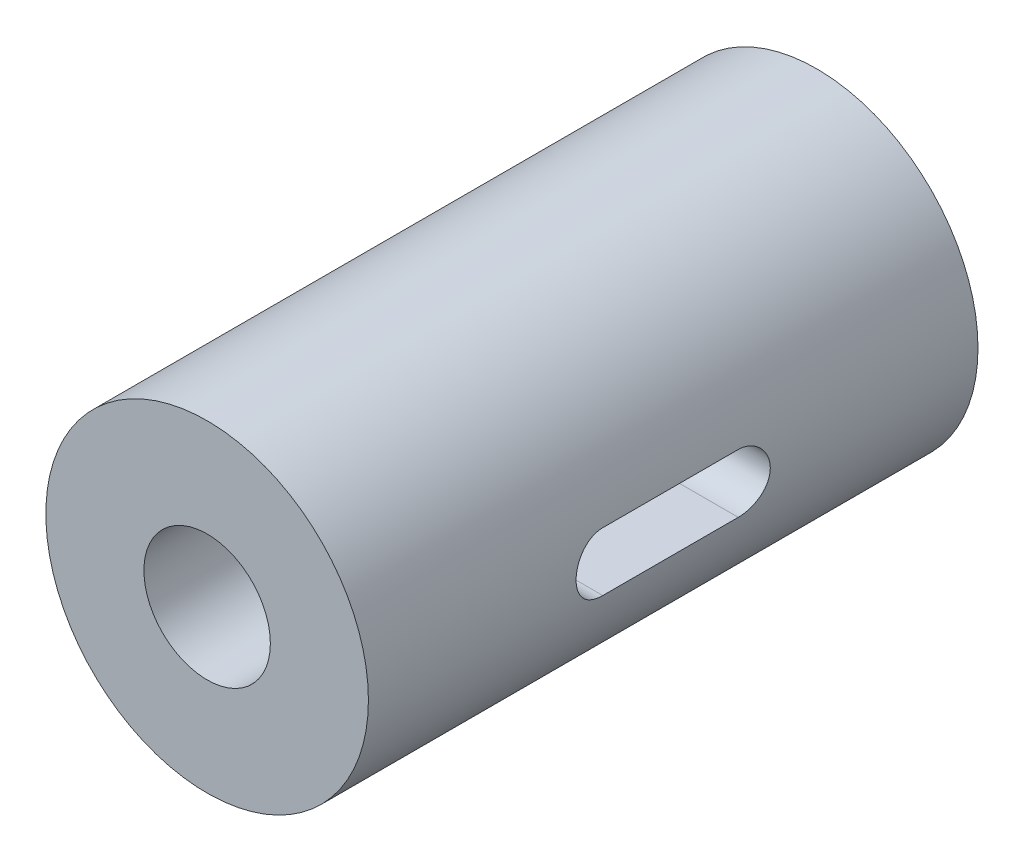
ISO-10303-21;
HEADER;
FILE_DESCRIPTION(('STEP AP214'),'2;1');
FILE_NAME('part.step','',(''),(''),'','','');
FILE_SCHEMA(('AUTOMOTIVE_DESIGN { 1 0 10303 214 1 1 1 1 }'));
ENDSEC;
DATA;
#1=APPLICATION_CONTEXT('core data for automotive mechanical design processes');
#2=APPLICATION_PROTOCOL_DEFINITION('international standard','automotive_design',2000,#1);
#3=PRODUCT_CONTEXT('',#1,'mechanical');
#4=PRODUCT('Part','Part','',(#3));
#5=PRODUCT_RELATED_PRODUCT_CATEGORY('part','',(#4));
#6=PRODUCT_DEFINITION_FORMATION('','',#4);
#7=PRODUCT_DEFINITION_CONTEXT('part definition',#1,'design');
#8=PRODUCT_DEFINITION('design','',#6,#7);
#9=PRODUCT_DEFINITION_SHAPE('','',#8);
#10=(LENGTH_UNIT() NAMED_UNIT(*) SI_UNIT(.MILLI.,.METRE.));
#11=(NAMED_UNIT(*) PLANE_ANGLE_UNIT() SI_UNIT($,.RADIAN.));
#12=(NAMED_UNIT(*) SI_UNIT($,.STERADIAN.) SOLID_ANGLE_UNIT());
#13=UNCERTAINTY_MEASURE_WITH_UNIT(LENGTH_MEASURE(1.E-05),#10,'distance_accuracy_value','');
#14=(GEOMETRIC_REPRESENTATION_CONTEXT(3) GLOBAL_UNCERTAINTY_ASSIGNED_CONTEXT((#13)) GLOBAL_UNIT_ASSIGNED_CONTEXT((#10,
#11,#12)) REPRESENTATION_CONTEXT('',''));
#15=CARTESIAN_POINT('',(0.,0.,0.));
#16=DIRECTION('',(0.,0.,1.));
#17=DIRECTION('',(1.,0.,0.));
#18=AXIS2_PLACEMENT_3D('',#15,#16,#17);
#19=CARTESIAN_POINT('',(-24.24,-23.1439997287949,0.));
#20=DIRECTION('',(0.,0.,1.));
#21=DIRECTION('',(1.,0.,0.));
#22=AXIS2_PLACEMENT_3D('',#19,#20,#21);
#23=PLANE('',#22);
#24=CARTESIAN_POINT('',(-24.24,-23.1439997287949,0.));
#25=DIRECTION('',(0.,0.,1.));
#26=DIRECTION('',(1.,0.,0.));
#27=AXIS2_PLACEMENT_3D('',#24,#25,#26);
#28=CIRCLE('',#27,1.8669);
#29=CARTESIAN_POINT('',(-22.3731,-23.1439997287949,0.));
#30=VERTEX_POINT('',#29);
#31=EDGE_CURVE('E200',#30,#30,#28,.T.);
#32=ORIENTED_EDGE('',*,*,#31,.T.);
#33=EDGE_LOOP('',(#32));
#34=FACE_BOUND('',#33,.T.);
#35=CARTESIAN_POINT('',(-24.24,-23.1439997287949,0.));
#36=DIRECTION('',(0.,0.,1.));
#37=DIRECTION('',(1.,0.,0.));
#38=AXIS2_PLACEMENT_3D('',#35,#36,#37);
#39=CIRCLE('',#38,4.7625);
#40=CARTESIAN_POINT('',(-19.4775,-23.1439997287949,0.));
#41=VERTEX_POINT('',#40);
#42=EDGE_CURVE('E204',#41,#41,#39,.T.);
#43=ORIENTED_EDGE('',*,*,#42,.F.);
#44=EDGE_LOOP('',(#43));
#45=FACE_BOUND('',#44,.T.);
#46=ADVANCED_FACE('F20',(#34,#45),#23,.F.);
#47=CARTESIAN_POINT('',(-24.24,-23.1439997287949,18.));
#48=DIRECTION('',(0.,0.,1.));
#49=DIRECTION('',(1.,0.,0.));
#50=AXIS2_PLACEMENT_3D('',#47,#48,#49);
#51=PLANE('',#50);
#52=CARTESIAN_POINT('',(-24.24,-23.1439997287949,18.));
#53=DIRECTION('',(0.,0.,1.));
#54=DIRECTION('',(1.,0.,0.));
#55=AXIS2_PLACEMENT_3D('',#52,#53,#54);
#56=CIRCLE('',#55,1.8669);
#57=CARTESIAN_POINT('',(-22.3731,-23.1439997287949,18.));
#58=VERTEX_POINT('',#57);
#59=EDGE_CURVE('E197',#58,#58,#56,.T.);
#60=ORIENTED_EDGE('',*,*,#59,.F.);
#61=EDGE_LOOP('',(#60));
#62=FACE_BOUND('',#61,.T.);
#63=CARTESIAN_POINT('',(-24.24,-23.1439997287949,18.));
#64=DIRECTION('',(0.,0.,1.));
#65=DIRECTION('',(1.,0.,0.));
#66=AXIS2_PLACEMENT_3D('',#63,#64,#65);
#67=CIRCLE('',#66,4.7625);
#68=CARTESIAN_POINT('',(-19.4775,-23.1439997287949,18.));
#69=VERTEX_POINT('',#68);
#70=EDGE_CURVE('E203',#69,#69,#67,.T.);
#71=ORIENTED_EDGE('',*,*,#70,.T.);
#72=EDGE_LOOP('',(#71));
#73=FACE_BOUND('',#72,.T.);
#74=ADVANCED_FACE('F22',(#62,#73),#51,.T.);
#75=CARTESIAN_POINT('',(-24.24,-23.1439997287949,0.));
#76=DIRECTION('',(0.,0.,1.));
#77=DIRECTION('',(1.,0.,0.));
#78=AXIS2_PLACEMENT_3D('',#75,#76,#77);
#79=CYLINDRICAL_SURFACE('',#78,4.7625);
#80=CARTESIAN_POINT('',(-19.5570638868334,-22.277099728795,11.));
#81=CARTESIAN_POINT('',(-19.5570932262736,-22.2770564212069,11.048341648724));
#82=CARTESIAN_POINT('',(-19.5563161306143,-22.2811404912829,11.0966616937286));
#83=CARTESIAN_POINT('',(-19.5533688885122,-22.2972326885362,11.1918525928624));
#84=CARTESIAN_POINT('',(-19.5512007258954,-22.3092295318456,11.2387254112901));
#85=CARTESIAN_POINT('',(-19.5456895382325,-22.3408210013647,11.3297688834935));
#86=CARTESIAN_POINT('',(-19.5423463112153,-22.3604169337729,11.3739390712052));
#87=CARTESIAN_POINT('',(-19.5348721451521,-22.4066209059899,11.4583698840435));
#88=CARTESIAN_POINT('',(-19.5307411644869,-22.4332293163156,11.4986303024366));
#89=CARTESIAN_POINT('',(-19.522101162779,-22.4930347652497,11.5745609487893));
#90=CARTESIAN_POINT('',(-19.5175886578223,-22.5262974290518,11.6101791009056));
#91=CARTESIAN_POINT('',(-19.5087249651163,-22.598328106054,11.6753649693394));
#92=CARTESIAN_POINT('',(-19.5043738022826,-22.6370969651312,11.7049317543221));
#93=CARTESIAN_POINT('',(-19.4962858532765,-22.7193813271402,11.7573715228513));
#94=CARTESIAN_POINT('',(-19.4925536807075,-22.7629287765019,11.780195151356));
#95=CARTESIAN_POINT('',(-19.4861636920902,-22.8533166788768,11.8181818381739));
#96=CARTESIAN_POINT('',(-19.4835057329271,-22.9001566922536,11.8333459170165));
#97=CARTESIAN_POINT('',(-19.4795881273201,-22.9952579678204,11.8554228374156));
#98=CARTESIAN_POINT('',(-19.4783134854278,-23.0434980463169,11.8624242272925));
#99=CARTESIAN_POINT('',(-19.4772544794617,-23.1404850246991,11.86825281692));
#100=CARTESIAN_POINT('',(-19.4774700304981,-23.1892318955571,11.8670804822926));
#101=CARTESIAN_POINT('',(-19.4793554191911,-23.2852394866604,11.8566628227031));
#102=CARTESIAN_POINT('',(-19.4810080449475,-23.3325109608594,11.8475130405213));
#103=CARTESIAN_POINT('',(-19.4855626043367,-23.4248359045784,11.8215512035274));
#104=CARTESIAN_POINT('',(-19.4884645730563,-23.4698893117667,11.8047389335209));
#105=CARTESIAN_POINT('',(-19.4952207253026,-23.5567793300984,11.7638369634896));
#106=CARTESIAN_POINT('',(-19.4990799439692,-23.5985973460272,11.7397086266397));
#107=CARTESIAN_POINT('',(-19.507323065086,-23.6776252921534,11.6848886446576));
#108=CARTESIAN_POINT('',(-19.5117069995712,-23.7148349407172,11.6541965987065));
#109=CARTESIAN_POINT('',(-19.5205878444077,-23.7841527908793,11.5865976286626));
#110=CARTESIAN_POINT('',(-19.5250854733405,-23.8161801864829,11.549607894926));
#111=CARTESIAN_POINT('',(-19.5336277733797,-23.8735970402874,11.4707261315686));
#112=CARTESIAN_POINT('',(-19.5376723170015,-23.8989846329167,11.4288327289499));
#113=CARTESIAN_POINT('',(-19.5448520162623,-23.9424227246049,11.3412233423957));
#114=CARTESIAN_POINT('',(-19.5479852531352,-23.9604577744001,11.2954995503767));
#115=CARTESIAN_POINT('',(-19.5529581808031,-23.9885422610652,11.2016317595259));
#116=CARTESIAN_POINT('',(-19.5547998011395,-23.9986036127504,11.1534914864592));
#117=CARTESIAN_POINT('',(-19.5562796385913,-24.0066539402234,11.0874805999237));
#118=CARTESIAN_POINT('',(-19.5565734431089,-24.0082467280365,11.0700083198718));
#119=CARTESIAN_POINT('',(-19.5569653843084,-24.0103682580658,11.0350266087597));
#120=CARTESIAN_POINT('',(-19.5570638496999,-24.0108987878253,11.0175172898293));
#121=CARTESIAN_POINT('',(-19.5570638868334,-24.0108997287949,11.));
#122=B_SPLINE_CURVE_WITH_KNOTS('',3,(#80,#81,#82,#83,#84,#85,#86,#87,#88,#89,#90,#91,#92,#93,
#94,#95,#96,#97,#98,#99,#100,#101,#102,#103,#104,#105,#106,#107,#108,#109,#110,#111,#112,#113,
#114,#115,#116,#117,#118,#119,#120,#121),.UNSPECIFIED.,.F.,.F.,(4,2,2,2,2,2,2,2,2,2,2,2,2,2,2,2,
2,2,2,2,4),(0.,0.144813919941381,0.289421775791772,0.434054499139951,0.578694865950792,
0.724839047417896,0.871005704296525,1.01821710018819,1.16540887701407,1.3109886161029,
1.45656006220548,1.60041164010353,1.74426725820042,1.88889622908486,2.03353403439601,
2.18024593684824,2.32699901646129,2.47405888577457,2.62089859219757,2.67351486670913,
2.72604252510231),.UNSPECIFIED.);
#123=CARTESIAN_POINT('',(-19.5570638868334,-22.277099728795,11.));
#124=VERTEX_POINT('',#123);
#125=CARTESIAN_POINT('',(-19.5570638868334,-24.0108997287949,11.));
#126=VERTEX_POINT('',#125);
#127=EDGE_CURVE('E100',#124,#126,#122,.T.);
#128=ORIENTED_EDGE('',*,*,#127,.F.);
#129=DIRECTION('',(0.,0.,1.));
#130=VECTOR('',#129,1.);
#131=CARTESIAN_POINT('',(-19.5570638868334,-22.277099728795,0.));
#132=LINE('',#131,#130);
#133=CARTESIAN_POINT('',(-19.5570638868334,-22.277099728795,7.));
#134=VERTEX_POINT('',#133);
#135=EDGE_CURVE('E86',#124,#134,#132,.F.);
#136=ORIENTED_EDGE('',*,*,#135,.T.);
#137=CARTESIAN_POINT('',(-19.5570638868334,-24.0108997287949,7.));
#138=CARTESIAN_POINT('',(-19.5570932262736,-24.010943036383,6.95165835127599));
#139=CARTESIAN_POINT('',(-19.5563161306143,-24.006858966307,6.90333830627141));
#140=CARTESIAN_POINT('',(-19.5533688885122,-23.9907667690537,6.80814740713765));
#141=CARTESIAN_POINT('',(-19.5512007258954,-23.9787699257443,6.76127458870992));
#142=CARTESIAN_POINT('',(-19.5456895382325,-23.9471784562252,6.6702311165065));
#143=CARTESIAN_POINT('',(-19.5423463112153,-23.927582523817,6.62606092879482));
#144=CARTESIAN_POINT('',(-19.5348721451521,-23.8813785516,6.54163011595649));
#145=CARTESIAN_POINT('',(-19.5307411644869,-23.8547701412743,6.5013696975634));
#146=CARTESIAN_POINT('',(-19.522101162779,-23.7949646923402,6.42543905121073));
#147=CARTESIAN_POINT('',(-19.5175886578223,-23.7617020285381,6.38982089909439));
#148=CARTESIAN_POINT('',(-19.5087249651163,-23.6896713515359,6.32463503066064));
#149=CARTESIAN_POINT('',(-19.5043738022826,-23.6509024924587,6.29506824567792));
#150=CARTESIAN_POINT('',(-19.4962858532765,-23.5686181304497,6.24262847714874));
#151=CARTESIAN_POINT('',(-19.4925536807075,-23.525070681088,6.21980484864398));
#152=CARTESIAN_POINT('',(-19.4861636920902,-23.4346827787131,6.18181816182608));
#153=CARTESIAN_POINT('',(-19.4835057329271,-23.3878427653363,6.16665408298355));
#154=CARTESIAN_POINT('',(-19.4795881273201,-23.2927414897695,6.14457716258443));
#155=CARTESIAN_POINT('',(-19.4783134854278,-23.244501411273,6.13757577270753));
#156=CARTESIAN_POINT('',(-19.4772544794617,-23.1475144328908,6.13174718308002));
#157=CARTESIAN_POINT('',(-19.4774700304981,-23.0987675620328,6.13291951770734));
#158=CARTESIAN_POINT('',(-19.4793554191911,-23.0027599709295,6.1433371772969));
#159=CARTESIAN_POINT('',(-19.4810080449475,-22.9554884967305,6.15248695947873));
#160=CARTESIAN_POINT('',(-19.4855626043367,-22.8631635530115,6.1784487964726));
#161=CARTESIAN_POINT('',(-19.4884645730563,-22.8181101458232,6.19526106647914));
#162=CARTESIAN_POINT('',(-19.4952207253026,-22.7312201274915,6.23616303651036));
#163=CARTESIAN_POINT('',(-19.4990799439692,-22.6894021115627,6.26029137336034));
#164=CARTESIAN_POINT('',(-19.507323065086,-22.6103741654365,6.31511135534238));
#165=CARTESIAN_POINT('',(-19.5117069995712,-22.5731645168727,6.34580340129347));
#166=CARTESIAN_POINT('',(-19.5205878444077,-22.5038466667106,6.41340237133737));
#167=CARTESIAN_POINT('',(-19.5250854733405,-22.471819271107,6.45039210507398));
#168=CARTESIAN_POINT('',(-19.5336277733797,-22.4144024173025,6.52927386843139));
#169=CARTESIAN_POINT('',(-19.5376723170015,-22.3890148246732,6.57116727105009));
#170=CARTESIAN_POINT('',(-19.5448520162623,-22.345576732985,6.65877665760434));
#171=CARTESIAN_POINT('',(-19.5479852531352,-22.3275416831898,6.70450044962332));
#172=CARTESIAN_POINT('',(-19.5529581808031,-22.2994571965247,6.7983682404741));
#173=CARTESIAN_POINT('',(-19.5547998011395,-22.2893958448395,6.8465085135408));
#174=CARTESIAN_POINT('',(-19.5562796385913,-22.2813455173665,6.91251940007631));
#175=CARTESIAN_POINT('',(-19.5565734431089,-22.2797527295534,6.92999168012817));
#176=CARTESIAN_POINT('',(-19.5569653843084,-22.2776311995241,6.96497339124035));
#177=CARTESIAN_POINT('',(-19.5570638496999,-22.2771006697646,6.98248271017068));
#178=CARTESIAN_POINT('',(-19.5570638868334,-22.277099728795,7.));
#179=B_SPLINE_CURVE_WITH_KNOTS('',3,(#137,#138,#139,#140,#141,#142,#143,#144,#145,#146,#147,
#148,#149,#150,#151,#152,#153,#154,#155,#156,#157,#158,#159,#160,#161,#162,#163,#164,#165,#166,
#167,#168,#169,#170,#171,#172,#173,#174,#175,#176,#177,#178),.UNSPECIFIED.,.F.,.F.,(4,2,2,2,2,2,
2,2,2,2,2,2,2,2,2,2,2,2,2,2,4),(0.,0.144813919941377,0.289421775791762,0.434054499139944,
0.578694865950791,0.724839047417894,0.87100570429653,1.01821710018818,1.16540887701407,
1.3109886161029,1.45656006220548,1.60041164010352,1.74426725820043,1.88889622908486,
2.03353403439601,2.18024593684824,2.32699901646129,2.47405888577457,2.62089859219758,
2.67351486670914,2.72604252510231),.UNSPECIFIED.);
#180=CARTESIAN_POINT('',(-19.5570638868334,-24.0108997287949,7.));
#181=VERTEX_POINT('',#180);
#182=EDGE_CURVE('E188',#181,#134,#179,.T.);
#183=ORIENTED_EDGE('',*,*,#182,.F.);
#184=DIRECTION('',(0.,0.,1.));
#185=VECTOR('',#184,1.);
#186=CARTESIAN_POINT('',(-19.5570638868334,-24.0108997287949,0.));
#187=LINE('',#186,#185);
#188=EDGE_CURVE('E108',#126,#181,#187,.F.);
#189=ORIENTED_EDGE('',*,*,#188,.F.);
#190=EDGE_LOOP('',(#128,#136,#183,#189));
#191=FACE_BOUND('',#190,.T.);
#192=CARTESIAN_POINT('',(-28.9229361131666,-24.0108997287949,11.));
#193=CARTESIAN_POINT('',(-28.9229067737263,-24.010943036383,11.048341648724));
#194=CARTESIAN_POINT('',(-28.9236838693857,-24.006858966307,11.0966616937286));
#195=CARTESIAN_POINT('',(-28.9266311114878,-23.9907667690537,11.1918525928624));
#196=CARTESIAN_POINT('',(-28.9287992741047,-23.9787699257443,11.2387254112901));
#197=CARTESIAN_POINT('',(-28.9343104617675,-23.9471784562252,11.3297688834935));
#198=CARTESIAN_POINT('',(-28.9376536887847,-23.927582523817,11.3739390712052));
#199=CARTESIAN_POINT('',(-28.9451278548479,-23.8813785516,11.4583698840435));
#200=CARTESIAN_POINT('',(-28.9492588355131,-23.8547701412743,11.4986303024366));
#201=CARTESIAN_POINT('',(-28.957898837221,-23.7949646923402,11.5745609487893));
#202=CARTESIAN_POINT('',(-28.9624113421777,-23.7617020285381,11.6101791009056));
#203=CARTESIAN_POINT('',(-28.9712750348837,-23.6896713515359,11.6753649693394));
#204=CARTESIAN_POINT('',(-28.9756261977174,-23.6509024924587,11.7049317543221));
#205=CARTESIAN_POINT('',(-28.9837141467235,-23.5686181304497,11.7573715228513));
#206=CARTESIAN_POINT('',(-28.9874463192925,-23.5250706810881,11.780195151356));
#207=CARTESIAN_POINT('',(-28.9938363079098,-23.4346827787131,11.8181818381739));
#208=CARTESIAN_POINT('',(-28.9964942670729,-23.3878427653363,11.8333459170165));
#209=CARTESIAN_POINT('',(-29.0004118726799,-23.2927414897695,11.8554228374156));
#210=CARTESIAN_POINT('',(-29.0016865145722,-23.244501411273,11.8624242272925));
#211=CARTESIAN_POINT('',(-29.0027455205383,-23.1475144328908,11.86825281692));
#212=CARTESIAN_POINT('',(-29.0025299695019,-23.0987675620328,11.8670804822926));
#213=CARTESIAN_POINT('',(-29.0006445808089,-23.0027599709294,11.8566628227031));
#214=CARTESIAN_POINT('',(-28.9989919550525,-22.9554884967305,11.8475130405213));
#215=CARTESIAN_POINT('',(-28.9944373956633,-22.8631635530115,11.8215512035274));
#216=CARTESIAN_POINT('',(-28.9915354269437,-22.8181101458232,11.8047389335209));
#217=CARTESIAN_POINT('',(-28.9847792746974,-22.7312201274915,11.7638369634896));
#218=CARTESIAN_POINT('',(-28.9809200560308,-22.6894021115627,11.7397086266397));
#219=CARTESIAN_POINT('',(-28.972676934914,-22.6103741654365,11.6848886446576));
#220=CARTESIAN_POINT('',(-28.9682930004288,-22.5731645168727,11.6541965987065));
#221=CARTESIAN_POINT('',(-28.9594121555923,-22.5038466667106,11.5865976286626));
#222=CARTESIAN_POINT('',(-28.9549145266595,-22.471819271107,11.549607894926));
#223=CARTESIAN_POINT('',(-28.9463722266203,-22.4144024173025,11.4707261315686));
#224=CARTESIAN_POINT('',(-28.9423276829985,-22.3890148246732,11.4288327289499));
#225=CARTESIAN_POINT('',(-28.9351479837377,-22.345576732985,11.3412233423957));
#226=CARTESIAN_POINT('',(-28.9320147468648,-22.3275416831898,11.2954995503767));
#227=CARTESIAN_POINT('',(-28.9270418191969,-22.2994571965247,11.2016317595259));
#228=CARTESIAN_POINT('',(-28.9252001988605,-22.2893958448395,11.1534914864592));
#229=CARTESIAN_POINT('',(-28.9237203614087,-22.2813455173665,11.0874805999237));
#230=CARTESIAN_POINT('',(-28.9234265568911,-22.2797527295534,11.0700083198718));
#231=CARTESIAN_POINT('',(-28.9230346156916,-22.2776311995241,11.0350266087597));
#232=CARTESIAN_POINT('',(-28.9229361503001,-22.2771006697646,11.0175172898293));
#233=CARTESIAN_POINT('',(-28.9229361131666,-22.277099728795,11.));
#234=B_SPLINE_CURVE_WITH_KNOTS('',3,(#192,#193,#194,#195,#196,#197,#198,#199,#200,#201,#202,
#203,#204,#205,#206,#207,#208,#209,#210,#211,#212,#213,#214,#215,#216,#217,#218,#219,#220,#221,
#222,#223,#224,#225,#226,#227,#228,#229,#230,#231,#232,#233),.UNSPECIFIED.,.F.,.F.,(4,2,2,2,2,2,
2,2,2,2,2,2,2,2,2,2,2,2,2,2,4),(0.,0.144813919941381,0.289421775791774,0.434054499139952,
0.578694865950791,0.724839047417893,0.871005704296524,1.01821710018818,1.16540887701407,
1.3109886161029,1.45656006220548,1.60041164010353,1.74426725820043,1.88889622908486,
2.03353403439601,2.18024593684825,2.32699901646129,2.47405888577457,2.62089859219757,
2.67351486670913,2.72604252510231),.UNSPECIFIED.);
#235=CARTESIAN_POINT('',(-28.9229361131666,-24.0108997287949,11.));
#236=VERTEX_POINT('',#235);
#237=CARTESIAN_POINT('',(-28.9229361131666,-22.277099728795,11.));
#238=VERTEX_POINT('',#237);
#239=EDGE_CURVE('E109',#236,#238,#234,.T.);
#240=ORIENTED_EDGE('',*,*,#239,.F.);
#241=DIRECTION('',(0.,0.,1.));
#242=VECTOR('',#241,1.);
#243=CARTESIAN_POINT('',(-28.9229361131666,-24.0108997287949,0.));
#244=LINE('',#243,#242);
#245=CARTESIAN_POINT('',(-28.9229361131666,-24.0108997287949,7.));
#246=VERTEX_POINT('',#245);
#247=EDGE_CURVE('E194',#246,#236,#244,.T.);
#248=ORIENTED_EDGE('',*,*,#247,.F.);
#249=CARTESIAN_POINT('',(-28.9229361131666,-22.277099728795,7.));
#250=CARTESIAN_POINT('',(-28.9229067737263,-22.2770564212069,6.95165835127599));
#251=CARTESIAN_POINT('',(-28.9236838693857,-22.2811404912829,6.9033383062714));
#252=CARTESIAN_POINT('',(-28.9266311114878,-22.2972326885362,6.80814740713765));
#253=CARTESIAN_POINT('',(-28.9287992741047,-22.3092295318456,6.76127458870992));
#254=CARTESIAN_POINT('',(-28.9343104617675,-22.3408210013647,6.6702311165065));
#255=CARTESIAN_POINT('',(-28.9376536887847,-22.3604169337729,6.62606092879482));
#256=CARTESIAN_POINT('',(-28.9451278548479,-22.4066209059899,6.54163011595649));
#257=CARTESIAN_POINT('',(-28.9492588355131,-22.4332293163156,6.5013696975634));
#258=CARTESIAN_POINT('',(-28.957898837221,-22.4930347652497,6.42543905121073));
#259=CARTESIAN_POINT('',(-28.9624113421777,-22.5262974290518,6.38982089909439));
#260=CARTESIAN_POINT('',(-28.9712750348837,-22.598328106054,6.32463503066064));
#261=CARTESIAN_POINT('',(-28.9756261977174,-22.6370969651311,6.29506824567792));
#262=CARTESIAN_POINT('',(-28.9837141467235,-22.7193813271402,6.24262847714874));
#263=CARTESIAN_POINT('',(-28.9874463192925,-22.7629287765019,6.21980484864398));
#264=CARTESIAN_POINT('',(-28.9938363079098,-22.8533166788768,6.18181816182608));
#265=CARTESIAN_POINT('',(-28.9964942670729,-22.9001566922536,6.16665408298355));
#266=CARTESIAN_POINT('',(-29.0004118726799,-22.9952579678204,6.14457716258443));
#267=CARTESIAN_POINT('',(-29.0016865145722,-23.0434980463169,6.13757577270753));
#268=CARTESIAN_POINT('',(-29.0027455205383,-23.1404850246991,6.13174718308002));
#269=CARTESIAN_POINT('',(-29.0025299695019,-23.1892318955571,6.13291951770734));
#270=CARTESIAN_POINT('',(-29.0006445808089,-23.2852394866604,6.1433371772969));
#271=CARTESIAN_POINT('',(-28.9989919550525,-23.3325109608594,6.15248695947873));
#272=CARTESIAN_POINT('',(-28.9944373956633,-23.4248359045784,6.1784487964726));
#273=CARTESIAN_POINT('',(-28.9915354269437,-23.4698893117667,6.19526106647914));
#274=CARTESIAN_POINT('',(-28.9847792746974,-23.5567793300984,6.23616303651036));
#275=CARTESIAN_POINT('',(-28.9809200560308,-23.5985973460272,6.26029137336034));
#276=CARTESIAN_POINT('',(-28.972676934914,-23.6776252921534,6.31511135534238));
#277=CARTESIAN_POINT('',(-28.9682930004288,-23.7148349407172,6.34580340129347));
#278=CARTESIAN_POINT('',(-28.9594121555923,-23.7841527908793,6.41340237133737));
#279=CARTESIAN_POINT('',(-28.9549145266595,-23.8161801864829,6.45039210507398));
#280=CARTESIAN_POINT('',(-28.9463722266203,-23.8735970402874,6.52927386843139));
#281=CARTESIAN_POINT('',(-28.9423276829985,-23.8989846329167,6.57116727105009));
#282=CARTESIAN_POINT('',(-28.9351479837377,-23.9424227246049,6.65877665760434));
#283=CARTESIAN_POINT('',(-28.9320147468648,-23.9604577744001,6.70450044962332));
#284=CARTESIAN_POINT('',(-28.9270418191969,-23.9885422610652,6.7983682404741));
#285=CARTESIAN_POINT('',(-28.9252001988605,-23.9986036127504,6.8465085135408));
#286=CARTESIAN_POINT('',(-28.9237203614087,-24.0066539402234,6.91251940007631));
#287=CARTESIAN_POINT('',(-28.9234265568911,-24.0082467280365,6.92999168012817));
#288=CARTESIAN_POINT('',(-28.9230346156916,-24.0103682580658,6.96497339124035));
#289=CARTESIAN_POINT('',(-28.9229361503001,-24.0108987878253,6.98248271017068));
#290=CARTESIAN_POINT('',(-28.9229361131666,-24.0108997287949,7.));
#291=B_SPLINE_CURVE_WITH_KNOTS('',3,(#249,#250,#251,#252,#253,#254,#255,#256,#257,#258,#259,
#260,#261,#262,#263,#264,#265,#266,#267,#268,#269,#270,#271,#272,#273,#274,#275,#276,#277,#278,
#279,#280,#281,#282,#283,#284,#285,#286,#287,#288,#289,#290),.UNSPECIFIED.,.F.,.F.,(4,2,2,2,2,2,
2,2,2,2,2,2,2,2,2,2,2,2,2,2,4),(0.,0.144813919941377,0.289421775791764,0.434054499139945,
0.57869486595079,0.724839047417894,0.871005704296529,1.01821710018819,1.16540887701407,
1.3109886161029,1.45656006220548,1.60041164010353,1.74426725820043,1.88889622908485,
2.033534034396,2.18024593684824,2.32699901646128,2.47405888577456,2.62089859219757,
2.67351486670913,2.72604252510231),.UNSPECIFIED.);
#292=CARTESIAN_POINT('',(-28.9229361131666,-22.277099728795,7.));
#293=VERTEX_POINT('',#292);
#294=EDGE_CURVE('E96',#293,#246,#291,.T.);
#295=ORIENTED_EDGE('',*,*,#294,.F.);
#296=DIRECTION('',(0.,0.,1.));
#297=VECTOR('',#296,1.);
#298=CARTESIAN_POINT('',(-28.9229361131666,-22.277099728795,0.));
#299=LINE('',#298,#297);
#300=EDGE_CURVE('E97',#293,#238,#299,.T.);
#301=ORIENTED_EDGE('',*,*,#300,.T.);
#302=EDGE_LOOP('',(#240,#248,#295,#301));
#303=FACE_BOUND('',#302,.T.);
#304=ORIENTED_EDGE('',*,*,#42,.T.);
#305=EDGE_LOOP('',(#304));
#306=FACE_BOUND('',#305,.T.);
#307=ORIENTED_EDGE('',*,*,#70,.F.);
#308=EDGE_LOOP('',(#307));
#309=FACE_BOUND('',#308,.T.);
#310=ADVANCED_FACE('F106',(#191,#303,#306,#309),#79,.T.);
#311=CARTESIAN_POINT('',(-24.24,-23.1439997287949,18.));
#312=DIRECTION('',(0.,0.,1.));
#313=DIRECTION('',(1.,0.,0.));
#314=AXIS2_PLACEMENT_3D('',#311,#312,#313);
#315=CYLINDRICAL_SURFACE('',#314,1.8669);
#316=CARTESIAN_POINT('',(-22.5865793033834,-22.277099728795,11.));
#317=CARTESIAN_POINT('',(-22.5865832364489,-22.2770983019327,11.0229478274225));
#318=CARTESIAN_POINT('',(-22.5861009691543,-22.2780115020299,11.0458830018543));
#319=CARTESIAN_POINT('',(-22.5842026136481,-22.2816442197723,11.0915592449792));
#320=CARTESIAN_POINT('',(-22.5827870110515,-22.2843627980835,11.1143004083869));
#321=CARTESIAN_POINT('',(-22.5772192199872,-22.2951510608914,11.1817494137659));
#322=CARTESIAN_POINT('',(-22.5717451286841,-22.3058539101807,11.2259571497505));
#323=CARTESIAN_POINT('',(-22.5579968938432,-22.3338027618553,11.3116565494307));
#324=CARTESIAN_POINT('',(-22.5497273353478,-22.351038055494,11.3531525287216));
#325=CARTESIAN_POINT('',(-22.5313319160546,-22.3914957035541,11.4327216458751));
#326=CARTESIAN_POINT('',(-22.5212036043131,-22.4147259795567,11.4707901643324));
#327=CARTESIAN_POINT('',(-22.4993695927069,-22.4684132586112,11.5453003330129));
#328=CARTESIAN_POINT('',(-22.4876031070886,-22.4992622372709,11.5814416838484));
#329=CARTESIAN_POINT('',(-22.4643138828996,-22.5664881781935,11.6482614183437));
#330=CARTESIAN_POINT('',(-22.4527912044943,-22.6028664872365,11.678938467098));
#331=CARTESIAN_POINT('',(-22.4305080131287,-22.6826307237164,11.7356493423182));
#332=CARTESIAN_POINT('',(-22.4198269257178,-22.7262958612445,11.7613245488436));
#333=CARTESIAN_POINT('',(-22.4012061852618,-22.817913470121,11.8048295598701));
#334=CARTESIAN_POINT('',(-22.3932650379247,-22.8658635865309,11.8226636421766));
#335=CARTESIAN_POINT('',(-22.3814571488021,-22.9614966276159,11.8488279878605));
#336=CARTESIAN_POINT('',(-22.3773658114178,-23.0090071466263,11.8576848543742));
#337=CARTESIAN_POINT('',(-22.3728901464203,-23.1050043107324,11.8673631503591));
#338=CARTESIAN_POINT('',(-22.372503983938,-23.1534904607552,11.8681885571565));
#339=CARTESIAN_POINT('',(-22.3753641335701,-23.2461624980112,11.8620162641954));
#340=CARTESIAN_POINT('',(-22.3783392645701,-23.2903974039808,11.855602631133));
#341=CARTESIAN_POINT('',(-22.3871943738099,-23.3770781247975,11.8361598674096));
#342=CARTESIAN_POINT('',(-22.3930745125226,-23.4195238406689,11.8231303712864));
#343=CARTESIAN_POINT('',(-22.4072987625375,-23.5022027249988,11.7907013615165));
#344=CARTESIAN_POINT('',(-22.4156784293245,-23.5423932784385,11.7712094411447));
#345=CARTESIAN_POINT('',(-22.4341177481914,-23.6190377159322,11.7265154307637));
#346=CARTESIAN_POINT('',(-22.4441780425332,-23.6554901628188,11.7013111564258));
#347=CARTESIAN_POINT('',(-22.466005730055,-23.726896641264,11.6434537302031));
#348=CARTESIAN_POINT('',(-22.4778455383775,-23.7614652429744,11.6103517248771));
#349=CARTESIAN_POINT('',(-22.5013140358519,-23.8247556017872,11.5388582960598));
#350=CARTESIAN_POINT('',(-22.5129425712716,-23.8534732453483,11.500463182806));
#351=CARTESIAN_POINT('',(-22.5352670293851,-23.9056071407801,11.4171363694923));
#352=CARTESIAN_POINT('',(-22.5458884711841,-23.9286912973445,11.3719754177661));
#353=CARTESIAN_POINT('',(-22.5640321446174,-23.9667369644782,11.2778207981561));
#354=CARTESIAN_POINT('',(-22.57156093128,-23.9817156765425,11.2288355013512));
#355=CARTESIAN_POINT('',(-22.5800919257712,-23.9984400232139,11.1494772401049));
#356=CARTESIAN_POINT('',(-22.5825063355529,-24.003098599815,11.1198427181406));
#357=CARTESIAN_POINT('',(-22.5857575085123,-24.0093329563735,11.0601472287749));
#358=CARTESIAN_POINT('',(-22.5865932259414,-24.0109066929143,11.0300859919829));
#359=CARTESIAN_POINT('',(-22.5865793033834,-24.0108997287949,11.));
#360=B_SPLINE_CURVE_WITH_KNOTS('',3,(#316,#317,#318,#319,#320,#321,#322,#323,#324,#325,#326,
#327,#328,#329,#330,#331,#332,#333,#334,#335,#336,#337,#338,#339,#340,#341,#342,#343,#344,#345,
#346,#347,#348,#349,#350,#351,#352,#353,#354,#355,#356,#357,#358,#359),.UNSPECIFIED.,.F.,.F.,(4,
2,2,2,2,2,2,2,2,2,2,2,2,2,2,2,2,2,2,2,2,4),(0.,0.0687960229668118,0.137556279539053,
0.274265240059556,0.410751053845891,0.54741814745149,0.693649636266564,0.839916799955361,
0.994418259276594,1.14883532383965,1.29355291177921,1.43819882926437,1.57195916739291,
1.70572689528474,1.84149639871529,1.97731790646327,2.12459031304772,2.27196590553072,
2.42662411870414,2.58095281371689,2.67105309124994,2.76121303161027),.UNSPECIFIED.);
#361=CARTESIAN_POINT('',(-22.5865793033834,-22.277099728795,11.));
#362=VERTEX_POINT('',#361);
#363=CARTESIAN_POINT('',(-22.5865793033834,-24.0108997287949,11.));
#364=VERTEX_POINT('',#363);
#365=EDGE_CURVE('E102',#362,#364,#360,.T.);
#366=ORIENTED_EDGE('',*,*,#365,.T.);
#367=DIRECTION('',(0.,0.,1.));
#368=VECTOR('',#367,1.);
#369=CARTESIAN_POINT('',(-22.5865793033834,-24.0108997287949,18.));
#370=LINE('',#369,#368);
#371=CARTESIAN_POINT('',(-22.5865793033834,-24.0108997287949,7.));
#372=VERTEX_POINT('',#371);
#373=EDGE_CURVE('E12',#364,#372,#370,.F.);
#374=ORIENTED_EDGE('',*,*,#373,.T.);
#375=CARTESIAN_POINT('',(-22.5865793033834,-24.0108997287949,7.));
#376=CARTESIAN_POINT('',(-22.5865832364489,-24.0109011556572,6.97705217257755));
#377=CARTESIAN_POINT('',(-22.5861009691543,-24.00998795556,6.95411699814571));
#378=CARTESIAN_POINT('',(-22.5842026136481,-24.0063552378176,6.90844075502083));
#379=CARTESIAN_POINT('',(-22.5827870110515,-24.0036366595064,6.88569959161314));
#380=CARTESIAN_POINT('',(-22.5772192199872,-23.9928483966985,6.81825058623406));
#381=CARTESIAN_POINT('',(-22.5717451286841,-23.9821455474092,6.77404285024944));
#382=CARTESIAN_POINT('',(-22.5579968938432,-23.9541966957346,6.68834345056933));
#383=CARTESIAN_POINT('',(-22.5497273353478,-23.9369614020959,6.64684747127838));
#384=CARTESIAN_POINT('',(-22.5313319160546,-23.8965037540358,6.56727835412492));
#385=CARTESIAN_POINT('',(-22.5212036043131,-23.8732734780331,6.52920983566755));
#386=CARTESIAN_POINT('',(-22.4993695927069,-23.8195861989787,6.45469966698715));
#387=CARTESIAN_POINT('',(-22.4876031070886,-23.788737220319,6.41855831615162));
#388=CARTESIAN_POINT('',(-22.4643138828996,-23.7215112793963,6.35173858165632));
#389=CARTESIAN_POINT('',(-22.4527912044943,-23.6851329703534,6.32106153290201));
#390=CARTESIAN_POINT('',(-22.4305080131287,-23.6053687338735,6.2643506576818));
#391=CARTESIAN_POINT('',(-22.4198269257178,-23.5617035963454,6.23867545115641));
#392=CARTESIAN_POINT('',(-22.4012061852618,-23.4700859874689,6.19517044012993));
#393=CARTESIAN_POINT('',(-22.3932650379247,-23.422135871059,6.17733635782338));
#394=CARTESIAN_POINT('',(-22.3814571488021,-23.326502829974,6.1511720121395));
#395=CARTESIAN_POINT('',(-22.3773658114178,-23.2789923109636,6.14231514562581));
#396=CARTESIAN_POINT('',(-22.3728901464203,-23.1829951468575,6.13263684964092));
#397=CARTESIAN_POINT('',(-22.372503983938,-23.1345089968347,6.13181144284351));
#398=CARTESIAN_POINT('',(-22.3753641335701,-23.0418369595787,6.13798373580457));
#399=CARTESIAN_POINT('',(-22.3783392645701,-22.9976020536091,6.14439736886698));
#400=CARTESIAN_POINT('',(-22.3871943738099,-22.9109213327924,6.16384013259041));
#401=CARTESIAN_POINT('',(-22.3930745125226,-22.868475616921,6.17686962871359));
#402=CARTESIAN_POINT('',(-22.4072987625375,-22.7857967325911,6.20929863848353));
#403=CARTESIAN_POINT('',(-22.4156784293245,-22.7456061791514,6.22879055885528));
#404=CARTESIAN_POINT('',(-22.4341177481914,-22.6689617416577,6.27348456923631));
#405=CARTESIAN_POINT('',(-22.4441780425332,-22.6325092947712,6.29868884357417));
#406=CARTESIAN_POINT('',(-22.4660057300551,-22.561102816326,6.35654626979695));
#407=CARTESIAN_POINT('',(-22.4778455383775,-22.5265342146155,6.38964827512286));
#408=CARTESIAN_POINT('',(-22.5013140358519,-22.4632438558027,6.46114170394015));
#409=CARTESIAN_POINT('',(-22.5129425712716,-22.4345262122416,6.49953681719399));
#410=CARTESIAN_POINT('',(-22.5352670293851,-22.3823923168098,6.58286363050774));
#411=CARTESIAN_POINT('',(-22.5458884711841,-22.3593081602454,6.62802458223385));
#412=CARTESIAN_POINT('',(-22.5640321446174,-22.3212624931117,6.72217920184387));
#413=CARTESIAN_POINT('',(-22.57156093128,-22.3062837810474,6.77116449864881));
#414=CARTESIAN_POINT('',(-22.5800919257712,-22.289559434376,6.85052275989511));
#415=CARTESIAN_POINT('',(-22.5825063355529,-22.2849008577749,6.88015728185936));
#416=CARTESIAN_POINT('',(-22.5857575085123,-22.2786665012164,6.93985277122514));
#417=CARTESIAN_POINT('',(-22.5865932259414,-22.2770927646756,6.96991400801707));
#418=CARTESIAN_POINT('',(-22.5865793033834,-22.277099728795,7.));
#419=B_SPLINE_CURVE_WITH_KNOTS('',3,(#375,#376,#377,#378,#379,#380,#381,#382,#383,#384,#385,
#386,#387,#388,#389,#390,#391,#392,#393,#394,#395,#396,#397,#398,#399,#400,#401,#402,#403,#404,
#405,#406,#407,#408,#409,#410,#411,#412,#413,#414,#415,#416,#417,#418),.UNSPECIFIED.,.F.,.F.,(4,
2,2,2,2,2,2,2,2,2,2,2,2,2,2,2,2,2,2,2,2,4),(0.,0.0687960229668161,0.137556279539059,
0.274265240059563,0.410751053845894,0.54741814745149,0.693649636266567,0.839916799955368,
0.994418259276597,1.14883532383965,1.29355291177921,1.43819882926437,1.57195916739291,
1.70572689528474,1.84149639871528,1.97731790646324,2.12459031304771,2.27196590553072,
2.42662411870414,2.58095281371689,2.67105309124994,2.76121303161027),.UNSPECIFIED.);
#420=CARTESIAN_POINT('',(-22.5865793033834,-22.277099728795,7.));
#421=VERTEX_POINT('',#420);
#422=EDGE_CURVE('E28',#372,#421,#419,.T.);
#423=ORIENTED_EDGE('',*,*,#422,.T.);
#424=DIRECTION('',(0.,0.,1.));
#425=VECTOR('',#424,1.);
#426=CARTESIAN_POINT('',(-22.5865793033834,-22.277099728795,18.));
#427=LINE('',#426,#425);
#428=EDGE_CURVE('E153',#362,#421,#427,.F.);
#429=ORIENTED_EDGE('',*,*,#428,.F.);
#430=EDGE_LOOP('',(#366,#374,#423,#429));
#431=FACE_BOUND('',#430,.T.);
#432=CARTESIAN_POINT('',(-25.8934206966166,-22.277099728795,7.));
#433=CARTESIAN_POINT('',(-25.8934167635511,-22.2770983019327,6.97705217257755));
#434=CARTESIAN_POINT('',(-25.8938990308457,-22.2780115020299,6.95411699814571));
#435=CARTESIAN_POINT('',(-25.8957973863519,-22.2816442197723,6.90844075502083));
#436=CARTESIAN_POINT('',(-25.8972129889485,-22.2843627980835,6.88569959161314));
#437=CARTESIAN_POINT('',(-25.9027807800128,-22.2951510608914,6.81825058623406));
#438=CARTESIAN_POINT('',(-25.9082548713159,-22.3058539101807,6.77404285024944));
#439=CARTESIAN_POINT('',(-25.9220031061568,-22.3338027618553,6.68834345056933));
#440=CARTESIAN_POINT('',(-25.9302726646522,-22.351038055494,6.64684747127838));
#441=CARTESIAN_POINT('',(-25.9486680839454,-22.3914957035541,6.56727835412492));
#442=CARTESIAN_POINT('',(-25.9587963956869,-22.4147259795567,6.52920983566755));
#443=CARTESIAN_POINT('',(-25.9806304072931,-22.4684132586112,6.45469966698715));
#444=CARTESIAN_POINT('',(-25.9923968929114,-22.4992622372709,6.41855831615162));
#445=CARTESIAN_POINT('',(-26.0156861171004,-22.5664881781935,6.35173858165632));
#446=CARTESIAN_POINT('',(-26.0272087955058,-22.6028664872364,6.32106153290201));
#447=CARTESIAN_POINT('',(-26.0494919868714,-22.6826307237164,6.2643506576818));
#448=CARTESIAN_POINT('',(-26.0601730742822,-22.7262958612445,6.23867545115641));
#449=CARTESIAN_POINT('',(-26.0787938147382,-22.817913470121,6.19517044012993));
#450=CARTESIAN_POINT('',(-26.0867349620753,-22.8658635865309,6.17733635782338));
#451=CARTESIAN_POINT('',(-26.0985428511979,-22.9614966276159,6.1511720121395));
#452=CARTESIAN_POINT('',(-26.1026341885822,-23.0090071466263,6.14231514562581));
#453=CARTESIAN_POINT('',(-26.1071098535797,-23.1050043107324,6.13263684964092));
#454=CARTESIAN_POINT('',(-26.107496016062,-23.1534904607552,6.13181144284351));
#455=CARTESIAN_POINT('',(-26.1046358664299,-23.2461624980112,6.13798373580457));
#456=CARTESIAN_POINT('',(-26.1016607354299,-23.2903974039808,6.14439736886698));
#457=CARTESIAN_POINT('',(-26.0928056261901,-23.3770781247975,6.1638401325904));
#458=CARTESIAN_POINT('',(-26.0869254874774,-23.4195238406689,6.17686962871359));
#459=CARTESIAN_POINT('',(-26.0727012374625,-23.5022027249988,6.20929863848354));
#460=CARTESIAN_POINT('',(-26.0643215706755,-23.5423932784385,6.22879055885529));
#461=CARTESIAN_POINT('',(-26.0458822518086,-23.6190377159322,6.27348456923632));
#462=CARTESIAN_POINT('',(-26.0358219574668,-23.6554901628188,6.29868884357417));
#463=CARTESIAN_POINT('',(-26.013994269945,-23.726896641264,6.35654626979695));
#464=CARTESIAN_POINT('',(-26.0021544616225,-23.7614652429744,6.38964827512287));
#465=CARTESIAN_POINT('',(-25.9786859641481,-23.8247556017872,6.46114170394017));
#466=CARTESIAN_POINT('',(-25.9670574287284,-23.8534732453483,6.499536817194));
#467=CARTESIAN_POINT('',(-25.9447329706149,-23.9056071407801,6.58286363050774));
#468=CARTESIAN_POINT('',(-25.9341115288159,-23.9286912973445,6.62802458223385));
#469=CARTESIAN_POINT('',(-25.9159678553826,-23.9667369644782,6.72217920184388));
#470=CARTESIAN_POINT('',(-25.90843906872,-23.9817156765425,6.77116449864881));
#471=CARTESIAN_POINT('',(-25.8999080742288,-23.9984400232139,6.85052275989511));
#472=CARTESIAN_POINT('',(-25.8974936644471,-24.003098599815,6.88015728185936));
#473=CARTESIAN_POINT('',(-25.8942424914877,-24.0093329563735,6.93985277122513));
#474=CARTESIAN_POINT('',(-25.8934067740586,-24.0109066929143,6.96991400801707));
#475=CARTESIAN_POINT('',(-25.8934206966166,-24.0108997287949,7.));
#476=B_SPLINE_CURVE_WITH_KNOTS('',3,(#432,#433,#434,#435,#436,#437,#438,#439,#440,#441,#442,
#443,#444,#445,#446,#447,#448,#449,#450,#451,#452,#453,#454,#455,#456,#457,#458,#459,#460,#461,
#462,#463,#464,#465,#466,#467,#468,#469,#470,#471,#472,#473,#474,#475),.UNSPECIFIED.,.F.,.F.,(4,
2,2,2,2,2,2,2,2,2,2,2,2,2,2,2,2,2,2,2,2,4),(0.,0.0687960229668153,0.137556279539057,
0.274265240059564,0.410751053845892,0.547418147451488,0.693649636266572,0.839916799955379,
0.994418259276602,1.14883532383965,1.29355291177922,1.43819882926437,1.57195916739291,
1.70572689528474,1.8414963987153,1.97731790646328,2.12459031304773,2.27196590553073,
2.42662411870415,2.5809528137169,2.67105309124994,2.76121303161027),.UNSPECIFIED.);
#477=CARTESIAN_POINT('',(-25.8934206966166,-22.277099728795,7.));
#478=VERTEX_POINT('',#477);
#479=CARTESIAN_POINT('',(-25.8934206966166,-24.0108997287949,7.));
#480=VERTEX_POINT('',#479);
#481=EDGE_CURVE('E163',#478,#480,#476,.T.);
#482=ORIENTED_EDGE('',*,*,#481,.T.);
#483=DIRECTION('',(0.,0.,1.));
#484=VECTOR('',#483,1.);
#485=CARTESIAN_POINT('',(-25.8934206966166,-24.0108997287949,18.));
#486=LINE('',#485,#484);
#487=CARTESIAN_POINT('',(-25.8934206966166,-24.0108997287949,11.));
#488=VERTEX_POINT('',#487);
#489=EDGE_CURVE('E154',#480,#488,#486,.T.);
#490=ORIENTED_EDGE('',*,*,#489,.T.);
#491=CARTESIAN_POINT('',(-25.8934206966166,-24.0108997287949,11.));
#492=CARTESIAN_POINT('',(-25.8934167635511,-24.0109011556572,11.0229478274225));
#493=CARTESIAN_POINT('',(-25.8938990308457,-24.00998795556,11.0458830018543));
#494=CARTESIAN_POINT('',(-25.8957973863519,-24.0063552378176,11.0915592449792));
#495=CARTESIAN_POINT('',(-25.8972129889485,-24.0036366595064,11.1143004083869));
#496=CARTESIAN_POINT('',(-25.9027807800128,-23.9928483966985,11.1817494137659));
#497=CARTESIAN_POINT('',(-25.9082548713159,-23.9821455474092,11.2259571497505));
#498=CARTESIAN_POINT('',(-25.9220031061568,-23.9541966957346,11.3116565494307));
#499=CARTESIAN_POINT('',(-25.9302726646522,-23.9369614020959,11.3531525287216));
#500=CARTESIAN_POINT('',(-25.9486680839454,-23.8965037540358,11.4327216458751));
#501=CARTESIAN_POINT('',(-25.9587963956869,-23.8732734780332,11.4707901643324));
#502=CARTESIAN_POINT('',(-25.9806304072931,-23.8195861989787,11.5453003330129));
#503=CARTESIAN_POINT('',(-25.9923968929114,-23.788737220319,11.5814416838484));
#504=CARTESIAN_POINT('',(-26.0156861171004,-23.7215112793963,11.6482614183437));
#505=CARTESIAN_POINT('',(-26.0272087955058,-23.6851329703535,11.678938467098));
#506=CARTESIAN_POINT('',(-26.0494919868714,-23.6053687338735,11.7356493423182));
#507=CARTESIAN_POINT('',(-26.0601730742822,-23.5617035963454,11.7613245488436));
#508=CARTESIAN_POINT('',(-26.0787938147382,-23.4700859874689,11.8048295598701));
#509=CARTESIAN_POINT('',(-26.0867349620753,-23.422135871059,11.8226636421766));
#510=CARTESIAN_POINT('',(-26.0985428511979,-23.326502829974,11.8488279878605));
#511=CARTESIAN_POINT('',(-26.1026341885822,-23.2789923109636,11.8576848543742));
#512=CARTESIAN_POINT('',(-26.1071098535797,-23.1829951468575,11.8673631503591));
#513=CARTESIAN_POINT('',(-26.107496016062,-23.1345089968347,11.8681885571565));
#514=CARTESIAN_POINT('',(-26.1046358664299,-23.0418369595787,11.8620162641954));
#515=CARTESIAN_POINT('',(-26.1016607354299,-22.9976020536091,11.855602631133));
#516=CARTESIAN_POINT('',(-26.0928056261901,-22.9109213327924,11.8361598674096));
#517=CARTESIAN_POINT('',(-26.0869254874774,-22.868475616921,11.8231303712864));
#518=CARTESIAN_POINT('',(-26.0727012374625,-22.7857967325911,11.7907013615165));
#519=CARTESIAN_POINT('',(-26.0643215706755,-22.7456061791514,11.7712094411447));
#520=CARTESIAN_POINT('',(-26.0458822518086,-22.6689617416577,11.7265154307637));
#521=CARTESIAN_POINT('',(-26.0358219574668,-22.6325092947712,11.7013111564258));
#522=CARTESIAN_POINT('',(-26.0139942699449,-22.561102816326,11.6434537302031));
#523=CARTESIAN_POINT('',(-26.0021544616225,-22.5265342146155,11.6103517248771));
#524=CARTESIAN_POINT('',(-25.9786859641481,-22.4632438558027,11.5388582960598));
#525=CARTESIAN_POINT('',(-25.9670574287284,-22.4345262122416,11.500463182806));
#526=CARTESIAN_POINT('',(-25.9447329706149,-22.3823923168098,11.4171363694923));
#527=CARTESIAN_POINT('',(-25.9341115288159,-22.3593081602454,11.3719754177661));
#528=CARTESIAN_POINT('',(-25.9159678553826,-22.3212624931117,11.2778207981561));
#529=CARTESIAN_POINT('',(-25.90843906872,-22.3062837810474,11.2288355013512));
#530=CARTESIAN_POINT('',(-25.8999080742288,-22.289559434376,11.1494772401049));
#531=CARTESIAN_POINT('',(-25.8974936644471,-22.2849008577749,11.1198427181406));
#532=CARTESIAN_POINT('',(-25.8942424914877,-22.2786665012164,11.0601472287749));
#533=CARTESIAN_POINT('',(-25.8934067740586,-22.2770927646756,11.0300859919829));
#534=CARTESIAN_POINT('',(-25.8934206966166,-22.277099728795,11.));
#535=B_SPLINE_CURVE_WITH_KNOTS('',3,(#491,#492,#493,#494,#495,#496,#497,#498,#499,#500,#501,
#502,#503,#504,#505,#506,#507,#508,#509,#510,#511,#512,#513,#514,#515,#516,#517,#518,#519,#520,
#521,#522,#523,#524,#525,#526,#527,#528,#529,#530,#531,#532,#533,#534),.UNSPECIFIED.,.F.,.F.,(4,
2,2,2,2,2,2,2,2,2,2,2,2,2,2,2,2,2,2,2,2,4),(0.,0.0687960229668118,0.137556279539053,
0.274265240059555,0.410751053845888,0.547418147451489,0.693649636266568,0.839916799955374,
0.994418259276601,1.14883532383965,1.29355291177921,1.43819882926437,1.57195916739291,
1.70572689528474,1.84149639871527,1.97731790646323,2.12459031304771,2.27196590553072,
2.42662411870414,2.58095281371689,2.67105309124994,2.76121303161027),.UNSPECIFIED.);
#536=CARTESIAN_POINT('',(-25.8934206966166,-22.277099728795,11.));
#537=VERTEX_POINT('',#536);
#538=EDGE_CURVE('E138',#488,#537,#535,.T.);
#539=ORIENTED_EDGE('',*,*,#538,.T.);
#540=DIRECTION('',(0.,0.,1.));
#541=VECTOR('',#540,1.);
#542=CARTESIAN_POINT('',(-25.8934206966166,-22.277099728795,18.));
#543=LINE('',#542,#541);
#544=EDGE_CURVE('E169',#478,#537,#543,.T.);
#545=ORIENTED_EDGE('',*,*,#544,.F.);
#546=EDGE_LOOP('',(#482,#490,#539,#545));
#547=FACE_BOUND('',#546,.T.);
#548=ORIENTED_EDGE('',*,*,#31,.F.);
#549=EDGE_LOOP('',(#548));
#550=FACE_BOUND('',#549,.T.);
#551=ORIENTED_EDGE('',*,*,#59,.T.);
#552=EDGE_LOOP('',(#551));
#553=FACE_BOUND('',#552,.T.);
#554=ADVANCED_FACE('F156',(#431,#547,#550,#553),#315,.F.);
#555=CARTESIAN_POINT('',(-19.4775,-23.1439997287949,11.));
#556=DIRECTION('',(-1.,0.,0.));
#557=DIRECTION('',(0.,0.,1.));
#558=AXIS2_PLACEMENT_3D('',#555,#556,#557);
#559=CYLINDRICAL_SURFACE('',#558,0.8669);
#560=ORIENTED_EDGE('',*,*,#239,.T.);
#561=DIRECTION('',(-1.,0.,0.));
#562=VECTOR('',#561,1.);
#563=CARTESIAN_POINT('',(-19.4775,-22.277099728795,11.));
#564=LINE('',#563,#562);
#565=EDGE_CURVE('E43',#537,#238,#564,.T.);
#566=ORIENTED_EDGE('',*,*,#565,.F.);
#567=ORIENTED_EDGE('',*,*,#538,.F.);
#568=DIRECTION('',(-1.,0.,0.));
#569=VECTOR('',#568,1.);
#570=CARTESIAN_POINT('',(-19.4775,-24.0108997287949,11.));
#571=LINE('',#570,#569);
#572=EDGE_CURVE('E316',#488,#236,#571,.T.);
#573=ORIENTED_EDGE('',*,*,#572,.T.);
#574=EDGE_LOOP('',(#560,#566,#567,#573));
#575=FACE_BOUND('',#574,.T.);
#576=ADVANCED_FACE('F132',(#575),#559,.F.);
#577=CARTESIAN_POINT('',(-19.4775,-22.277099728795,0.));
#578=DIRECTION('',(0.,-1.,0.));
#579=DIRECTION('',(0.,0.,-1.));
#580=AXIS2_PLACEMENT_3D('',#577,#578,#579);
#581=PLANE('',#580);
#582=DIRECTION('',(-1.,0.,0.));
#583=VECTOR('',#582,1.);
#584=CARTESIAN_POINT('',(-19.4775,-22.277099728795,7.));
#585=LINE('',#584,#583);
#586=EDGE_CURVE('E103',#478,#293,#585,.T.);
#587=ORIENTED_EDGE('',*,*,#586,.F.);
#588=ORIENTED_EDGE('',*,*,#544,.T.);
#589=ORIENTED_EDGE('',*,*,#565,.T.);
#590=ORIENTED_EDGE('',*,*,#300,.F.);
#591=EDGE_LOOP('',(#587,#588,#589,#590));
#592=FACE_BOUND('',#591,.T.);
#593=ADVANCED_FACE('F274',(#592),#581,.T.);
#594=CARTESIAN_POINT('',(-19.4775,-23.1439997287949,7.));
#595=DIRECTION('',(-1.,0.,0.));
#596=DIRECTION('',(0.,0.,1.));
#597=AXIS2_PLACEMENT_3D('',#594,#595,#596);
#598=CYLINDRICAL_SURFACE('',#597,0.8669);
#599=ORIENTED_EDGE('',*,*,#294,.T.);
#600=DIRECTION('',(-1.,0.,0.));
#601=VECTOR('',#600,1.);
#602=CARTESIAN_POINT('',(-19.4775,-24.0108997287949,7.));
#603=LINE('',#602,#601);
#604=EDGE_CURVE('E325',#480,#246,#603,.T.);
#605=ORIENTED_EDGE('',*,*,#604,.F.);
#606=ORIENTED_EDGE('',*,*,#481,.F.);
#607=ORIENTED_EDGE('',*,*,#586,.T.);
#608=EDGE_LOOP('',(#599,#605,#606,#607));
#609=FACE_BOUND('',#608,.T.);
#610=ADVANCED_FACE('F174',(#609),#598,.F.);
#611=CARTESIAN_POINT('',(-19.4775,-24.0108997287949,0.));
#612=DIRECTION('',(0.,-1.,0.));
#613=DIRECTION('',(0.,0.,-1.));
#614=AXIS2_PLACEMENT_3D('',#611,#612,#613);
#615=PLANE('',#614);
#616=ORIENTED_EDGE('',*,*,#247,.T.);
#617=ORIENTED_EDGE('',*,*,#572,.F.);
#618=ORIENTED_EDGE('',*,*,#489,.F.);
#619=ORIENTED_EDGE('',*,*,#604,.T.);
#620=EDGE_LOOP('',(#616,#617,#618,#619));
#621=FACE_BOUND('',#620,.T.);
#622=ADVANCED_FACE('F280',(#621),#615,.F.);
#623=ORIENTED_EDGE('',*,*,#188,.T.);
#624=EDGE_CURVE('E113',#181,#372,#603,.T.);
#625=ORIENTED_EDGE('',*,*,#624,.T.);
#626=ORIENTED_EDGE('',*,*,#373,.F.);
#627=EDGE_CURVE('E35',#126,#364,#571,.T.);
#628=ORIENTED_EDGE('',*,*,#627,.F.);
#629=EDGE_LOOP('',(#623,#625,#626,#628));
#630=FACE_BOUND('',#629,.T.);
#631=ADVANCED_FACE('F134',(#630),#615,.F.);
#632=ORIENTED_EDGE('',*,*,#182,.T.);
#633=EDGE_CURVE('E92',#134,#421,#585,.T.);
#634=ORIENTED_EDGE('',*,*,#633,.T.);
#635=ORIENTED_EDGE('',*,*,#422,.F.);
#636=ORIENTED_EDGE('',*,*,#624,.F.);
#637=EDGE_LOOP('',(#632,#634,#635,#636));
#638=FACE_BOUND('',#637,.T.);
#639=ADVANCED_FACE('F170',(#638),#598,.F.);
#640=EDGE_CURVE('E89',#124,#362,#564,.T.);
#641=ORIENTED_EDGE('',*,*,#640,.T.);
#642=ORIENTED_EDGE('',*,*,#428,.T.);
#643=ORIENTED_EDGE('',*,*,#633,.F.);
#644=ORIENTED_EDGE('',*,*,#135,.F.);
#645=EDGE_LOOP('',(#641,#642,#643,#644));
#646=FACE_BOUND('',#645,.T.);
#647=ADVANCED_FACE('F88',(#646),#581,.T.);
#648=ORIENTED_EDGE('',*,*,#127,.T.);
#649=ORIENTED_EDGE('',*,*,#627,.T.);
#650=ORIENTED_EDGE('',*,*,#365,.F.);
#651=ORIENTED_EDGE('',*,*,#640,.F.);
#652=EDGE_LOOP('',(#648,#649,#650,#651));
#653=FACE_BOUND('',#652,.T.);
#654=ADVANCED_FACE('F99',(#653),#559,.F.);
#655=CLOSED_SHELL('',(#46,#74,#310,#554,#576,#593,#610,#622,#631,#639,#647,#654));
#656=MANIFOLD_SOLID_BREP('B1',#655);
#657=ADVANCED_BREP_SHAPE_REPRESENTATION('',(#18,#656),#14);
#658=SHAPE_DEFINITION_REPRESENTATION(#9,#657);
ENDSEC;
END-ISO-10303-21;
